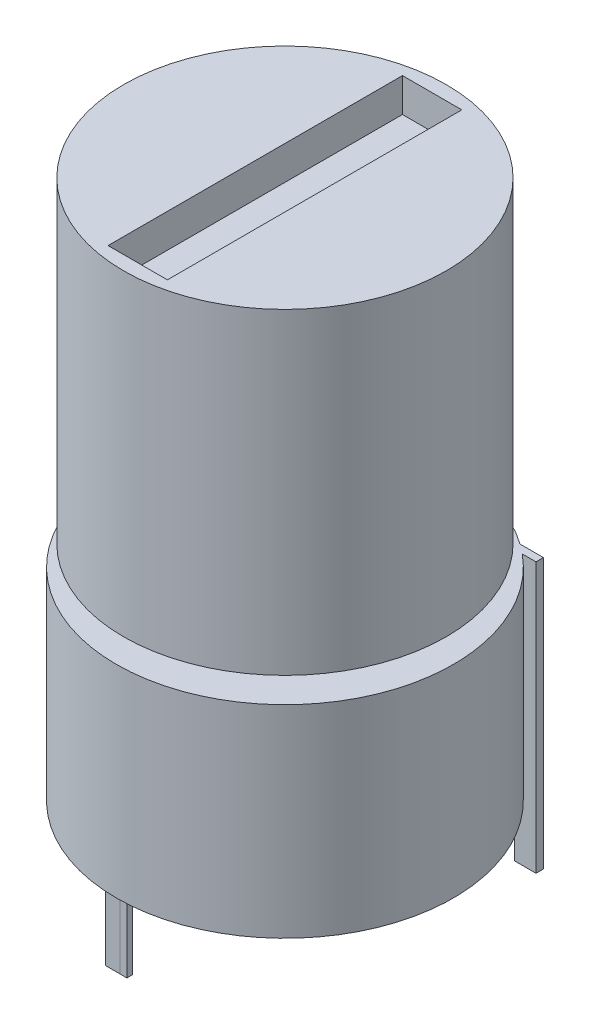
ISO-10303-21;
HEADER;
FILE_DESCRIPTION(('STEP AP214'),'2;1');
FILE_NAME('part.step','',(''),(''),'','','');
FILE_SCHEMA(('AUTOMOTIVE_DESIGN { 1 0 10303 214 1 1 1 1 }'));
ENDSEC;
DATA;
#1=APPLICATION_CONTEXT('core data for automotive mechanical design processes');
#2=APPLICATION_PROTOCOL_DEFINITION('international standard','automotive_design',2000,#1);
#3=PRODUCT_CONTEXT('',#1,'mechanical');
#4=PRODUCT('Part','Part','',(#3));
#5=PRODUCT_RELATED_PRODUCT_CATEGORY('part','',(#4));
#6=PRODUCT_DEFINITION_FORMATION('','',#4);
#7=PRODUCT_DEFINITION_CONTEXT('part definition',#1,'design');
#8=PRODUCT_DEFINITION('design','',#6,#7);
#9=PRODUCT_DEFINITION_SHAPE('','',#8);
#10=(LENGTH_UNIT() NAMED_UNIT(*) SI_UNIT(.MILLI.,.METRE.));
#11=(NAMED_UNIT(*) PLANE_ANGLE_UNIT() SI_UNIT($,.RADIAN.));
#12=(NAMED_UNIT(*) SI_UNIT($,.STERADIAN.) SOLID_ANGLE_UNIT());
#13=UNCERTAINTY_MEASURE_WITH_UNIT(LENGTH_MEASURE(1.E-05),#10,'distance_accuracy_value','');
#14=(GEOMETRIC_REPRESENTATION_CONTEXT(3) GLOBAL_UNCERTAINTY_ASSIGNED_CONTEXT((#13)) GLOBAL_UNIT_ASSIGNED_CONTEXT((#10,
#11,#12)) REPRESENTATION_CONTEXT('',''));
#15=CARTESIAN_POINT('',(0.,0.,0.));
#16=DIRECTION('',(0.,0.,1.));
#17=DIRECTION('',(1.,0.,0.));
#18=AXIS2_PLACEMENT_3D('',#15,#16,#17);
#19=CARTESIAN_POINT('',(0.,3.,0.));
#20=DIRECTION('',(0.,-1.,0.));
#21=DIRECTION('',(0.,0.,-1.));
#22=AXIS2_PLACEMENT_3D('',#19,#20,#21);
#23=CYLINDRICAL_SURFACE('',#22,2.5);
#24=CARTESIAN_POINT('',(0.,0.,0.));
#25=DIRECTION('',(0.,1.,0.));
#26=DIRECTION('',(0.,0.,1.));
#27=AXIS2_PLACEMENT_3D('',#24,#25,#26);
#28=CIRCLE('',#27,2.5);
#29=CARTESIAN_POINT('',(-1.59070932317395,0.,-1.92863782218629));
#30=VERTEX_POINT('',#29);
#31=CARTESIAN_POINT('',(1.59070932317395,0.,-1.92863782218629));
#32=VERTEX_POINT('',#31);
#33=EDGE_CURVE('E279',#30,#32,#28,.T.);
#34=ORIENTED_EDGE('',*,*,#33,.T.);
#35=DIRECTION('',(0.,-1.,0.));
#36=VECTOR('',#35,1.);
#37=CARTESIAN_POINT('',(1.59070932317395,3.,-1.92863782218629));
#38=LINE('',#37,#36);
#39=CARTESIAN_POINT('',(1.59070932317395,3.,-1.92863782218629));
#40=VERTEX_POINT('',#39);
#41=EDGE_CURVE('E401',#32,#40,#38,.F.);
#42=ORIENTED_EDGE('',*,*,#41,.T.);
#43=CARTESIAN_POINT('',(0.,3.,0.));
#44=DIRECTION('',(0.,1.,0.));
#45=DIRECTION('',(0.,0.,1.));
#46=AXIS2_PLACEMENT_3D('',#43,#44,#45);
#47=CIRCLE('',#46,2.5);
#48=CARTESIAN_POINT('',(-1.59070932317395,3.,-1.92863782218629));
#49=VERTEX_POINT('',#48);
#50=EDGE_CURVE('E50',#49,#40,#47,.T.);
#51=ORIENTED_EDGE('',*,*,#50,.F.);
#52=DIRECTION('',(0.,-1.,0.));
#53=VECTOR('',#52,1.);
#54=CARTESIAN_POINT('',(-1.59070932317395,3.,-1.92863782218629));
#55=LINE('',#54,#53);
#56=EDGE_CURVE('E325',#49,#30,#55,.T.);
#57=ORIENTED_EDGE('',*,*,#56,.T.);
#58=EDGE_LOOP('',(#34,#42,#51,#57));
#59=FACE_BOUND('',#58,.T.);
#60=ADVANCED_FACE('F41',(#59),#23,.T.);
#61=CARTESIAN_POINT('',(0.,0.,0.));
#62=DIRECTION('',(0.,1.,0.));
#63=DIRECTION('',(0.,0.,1.));
#64=AXIS2_PLACEMENT_3D('',#61,#62,#63);
#65=PLANE('',#64);
#66=ORIENTED_EDGE('',*,*,#33,.F.);
#67=DIRECTION('',(1.,0.,0.));
#68=VECTOR('',#67,1.);
#69=CARTESIAN_POINT('',(0.,0.,-1.92863782218629));
#70=LINE('',#69,#68);
#71=CARTESIAN_POINT('',(-1.4576514021515,0.,-1.92863782218629));
#72=VERTEX_POINT('',#71);
#73=EDGE_CURVE('E321',#30,#72,#70,.T.);
#74=ORIENTED_EDGE('',*,*,#73,.T.);
#75=DIRECTION('',(0.0960597372214122,0.,-0.995375570769623));
#76=VECTOR('',#75,1.);
#77=CARTESIAN_POINT('',(-1.62860866311877,0.,-0.157170544274803));
#78=LINE('',#77,#76);
#79=CARTESIAN_POINT('',(-1.44703463694375,0.,-2.03864924876376));
#80=VERTEX_POINT('',#79);
#81=EDGE_CURVE('E210',#72,#80,#78,.T.);
#82=ORIENTED_EDGE('',*,*,#81,.T.);
#83=CARTESIAN_POINT('',(1.44703463694375,0.,-2.03864924876376));
#84=VERTEX_POINT('',#83);
#85=EDGE_CURVE('E275',#84,#80,#28,.T.);
#86=ORIENTED_EDGE('',*,*,#85,.F.);
#87=DIRECTION('',(0.273201530301705,0.,0.961956820154006));
#88=VECTOR('',#87,1.);
#89=CARTESIAN_POINT('',(1.87480279385373,0.,-0.532455284440677));
#90=LINE('',#89,#88);
#91=CARTESIAN_POINT('',(1.47827854463477,0.,-1.92863782218629));
#92=VERTEX_POINT('',#91);
#93=EDGE_CURVE('E388',#84,#92,#90,.T.);
#94=ORIENTED_EDGE('',*,*,#93,.T.);
#95=DIRECTION('',(1.,0.,0.));
#96=VECTOR('',#95,1.);
#97=CARTESIAN_POINT('',(0.,0.,-1.92863782218629));
#98=LINE('',#97,#96);
#99=EDGE_CURVE('E404',#92,#32,#98,.T.);
#100=ORIENTED_EDGE('',*,*,#99,.T.);
#101=EDGE_LOOP('',(#66,#74,#82,#86,#94,#100));
#102=FACE_BOUND('',#101,.T.);
#103=DIRECTION('',(0.,0.,1.));
#104=VECTOR('',#103,1.);
#105=CARTESIAN_POINT('',(-0.215905033171868,0.,2.44807685298548));
#106=LINE('',#105,#104);
#107=CARTESIAN_POINT('',(-0.215905033171868,0.,2.3625477556104));
#108=VERTEX_POINT('',#107);
#109=CARTESIAN_POINT('',(-0.215905033171868,0.,2.44807685298548));
#110=VERTEX_POINT('',#109);
#111=EDGE_CURVE('E177',#108,#110,#106,.T.);
#112=ORIENTED_EDGE('',*,*,#111,.T.);
#113=DIRECTION('',(-1.,0.,0.));
#114=VECTOR('',#113,1.);
#115=CARTESIAN_POINT('',(0.,0.,2.44807685298548));
#116=LINE('',#115,#114);
#117=CARTESIAN_POINT('',(0.,0.,2.44807685298548));
#118=VERTEX_POINT('',#117);
#119=EDGE_CURVE('E204',#118,#110,#116,.T.);
#120=ORIENTED_EDGE('',*,*,#119,.F.);
#121=DIRECTION('',(-0.999900782422396,0.,-0.0140863519436609));
#122=VECTOR('',#121,1.);
#123=CARTESIAN_POINT('',(0.,0.,2.44807685298548));
#124=LINE('',#123,#122);
#125=CARTESIAN_POINT('',(0.105106814470731,0.,2.4495575714791));
#126=VERTEX_POINT('',#125);
#127=EDGE_CURVE('E203',#126,#118,#124,.T.);
#128=ORIENTED_EDGE('',*,*,#127,.F.);
#129=DIRECTION('',(0.,0.,-1.));
#130=VECTOR('',#129,1.);
#131=CARTESIAN_POINT('',(0.105106814470731,0.,2.4495575714791));
#132=LINE('',#131,#130);
#133=CARTESIAN_POINT('',(0.105106814470731,0.,2.3625477556104));
#134=VERTEX_POINT('',#133);
#135=EDGE_CURVE('E201',#126,#134,#132,.T.);
#136=ORIENTED_EDGE('',*,*,#135,.T.);
#137=DIRECTION('',(1.,0.,0.));
#138=VECTOR('',#137,1.);
#139=CARTESIAN_POINT('',(0.473512734090996,0.,2.3625477556104));
#140=LINE('',#139,#138);
#141=EDGE_CURVE('E193',#108,#134,#140,.T.);
#142=ORIENTED_EDGE('',*,*,#141,.F.);
#143=EDGE_LOOP('',(#112,#120,#128,#136,#142));
#144=FACE_BOUND('',#143,.T.);
#145=ADVANCED_FACE('F199',(#102,#144),#65,.F.);
#146=CARTESIAN_POINT('',(0.,10.3,0.));
#147=DIRECTION('',(0.,-1.,0.));
#148=DIRECTION('',(0.,0.,-1.));
#149=AXIS2_PLACEMENT_3D('',#146,#147,#148);
#150=CYLINDRICAL_SURFACE('',#149,0.18795365504404);
#151=CARTESIAN_POINT('',(0.,3.,0.));
#152=DIRECTION('',(0.,1.,0.));
#153=DIRECTION('',(0.,0.,1.));
#154=AXIS2_PLACEMENT_3D('',#151,#152,#153);
#155=CIRCLE('',#154,0.18795365504404);
#156=CARTESIAN_POINT('',(0.,3.,0.18795365504404));
#157=VERTEX_POINT('',#156);
#158=EDGE_CURVE('E268',#157,#157,#155,.T.);
#159=ORIENTED_EDGE('',*,*,#158,.T.);
#160=EDGE_LOOP('',(#159));
#161=FACE_BOUND('',#160,.T.);
#162=CARTESIAN_POINT('',(0.,3.3,0.));
#163=DIRECTION('',(0.,1.,0.));
#164=DIRECTION('',(0.,0.,1.));
#165=AXIS2_PLACEMENT_3D('',#162,#163,#164);
#166=CIRCLE('',#165,0.18795365504404);
#167=CARTESIAN_POINT('',(0.,3.3,0.18795365504404));
#168=VERTEX_POINT('',#167);
#169=EDGE_CURVE('E11',#168,#168,#166,.T.);
#170=ORIENTED_EDGE('',*,*,#169,.F.);
#171=EDGE_LOOP('',(#170));
#172=FACE_BOUND('',#171,.T.);
#173=ADVANCED_FACE('F483',(#161,#172),#150,.T.);
#174=CARTESIAN_POINT('',(1.44703463694375,3.,-2.03864924876376));
#175=VERTEX_POINT('',#174);
#176=CARTESIAN_POINT('',(-1.44703463694375,3.,-2.03864924876376));
#177=VERTEX_POINT('',#176);
#178=EDGE_CURVE('E278',#175,#177,#47,.T.);
#179=ORIENTED_EDGE('',*,*,#178,.F.);
#180=DIRECTION('',(0.,1.,0.));
#181=VECTOR('',#180,1.);
#182=CARTESIAN_POINT('',(1.44703463694375,-1.,-2.03864924876376));
#183=LINE('',#182,#181);
#184=EDGE_CURVE('E295',#84,#175,#183,.T.);
#185=ORIENTED_EDGE('',*,*,#184,.F.);
#186=ORIENTED_EDGE('',*,*,#85,.T.);
#187=DIRECTION('',(0.,1.,0.));
#188=VECTOR('',#187,1.);
#189=CARTESIAN_POINT('',(-1.44703463694375,-1.,-2.03864924876376));
#190=LINE('',#189,#188);
#191=EDGE_CURVE('E293',#80,#177,#190,.T.);
#192=ORIENTED_EDGE('',*,*,#191,.T.);
#193=EDGE_LOOP('',(#179,#185,#186,#192));
#194=FACE_BOUND('',#193,.T.);
#195=ADVANCED_FACE('F43',(#194),#23,.T.);
#196=CARTESIAN_POINT('',(0.,3.,0.));
#197=DIRECTION('',(0.,1.,0.));
#198=DIRECTION('',(0.,0.,1.));
#199=AXIS2_PLACEMENT_3D('',#196,#197,#198);
#200=PLANE('',#199);
#201=ORIENTED_EDGE('',*,*,#50,.T.);
#202=DIRECTION('',(1.,0.,0.));
#203=VECTOR('',#202,1.);
#204=CARTESIAN_POINT('',(1.794561396045,3.,-1.92863782218629));
#205=LINE('',#204,#203);
#206=CARTESIAN_POINT('',(1.794561396045,3.,-1.92863782218629));
#207=VERTEX_POINT('',#206);
#208=EDGE_CURVE('E345',#40,#207,#205,.T.);
#209=ORIENTED_EDGE('',*,*,#208,.T.);
#210=DIRECTION('',(0.,0.,-1.));
#211=VECTOR('',#210,1.);
#212=CARTESIAN_POINT('',(1.794561396045,3.,-2.03864924876376));
#213=LINE('',#212,#211);
#214=CARTESIAN_POINT('',(1.794561396045,3.,-2.03864924876376));
#215=VERTEX_POINT('',#214);
#216=EDGE_CURVE('E348',#207,#215,#213,.T.);
#217=ORIENTED_EDGE('',*,*,#216,.T.);
#218=DIRECTION('',(-1.,0.,0.));
#219=VECTOR('',#218,1.);
#220=CARTESIAN_POINT('',(1.44703463694375,3.,-2.03864924876376));
#221=LINE('',#220,#219);
#222=EDGE_CURVE('E366',#215,#175,#221,.T.);
#223=ORIENTED_EDGE('',*,*,#222,.T.);
#224=ORIENTED_EDGE('',*,*,#178,.T.);
#225=DIRECTION('',(-1.,0.,0.));
#226=VECTOR('',#225,1.);
#227=CARTESIAN_POINT('',(-1.76705853940064,3.,-2.03864924876376));
#228=LINE('',#227,#226);
#229=CARTESIAN_POINT('',(-1.76705853940064,3.,-2.03864924876376));
#230=VERTEX_POINT('',#229);
#231=EDGE_CURVE('E307',#177,#230,#228,.T.);
#232=ORIENTED_EDGE('',*,*,#231,.T.);
#233=DIRECTION('',(0.,0.,1.));
#234=VECTOR('',#233,1.);
#235=CARTESIAN_POINT('',(-1.76705853940064,3.,-1.92863782218629));
#236=LINE('',#235,#234);
#237=CARTESIAN_POINT('',(-1.76705853940064,3.,-1.92863782218629));
#238=VERTEX_POINT('',#237);
#239=EDGE_CURVE('E423',#230,#238,#236,.T.);
#240=ORIENTED_EDGE('',*,*,#239,.T.);
#241=DIRECTION('',(1.,0.,0.));
#242=VECTOR('',#241,1.);
#243=CARTESIAN_POINT('',(-1.4576514021515,3.,-1.92863782218629));
#244=LINE('',#243,#242);
#245=EDGE_CURVE('E411',#238,#49,#244,.T.);
#246=ORIENTED_EDGE('',*,*,#245,.T.);
#247=EDGE_LOOP('',(#201,#209,#217,#223,#224,#232,#240,#246));
#248=FACE_BOUND('',#247,.T.);
#249=ORIENTED_EDGE('',*,*,#158,.F.);
#250=EDGE_LOOP('',(#249));
#251=FACE_BOUND('',#250,.T.);
#252=ADVANCED_FACE('F450',(#248,#251),#200,.T.);
#253=CARTESIAN_POINT('',(0.,3.3,0.));
#254=DIRECTION('',(0.,1.,0.));
#255=DIRECTION('',(0.,0.,1.));
#256=AXIS2_PLACEMENT_3D('',#253,#254,#255);
#257=CYLINDRICAL_SURFACE('',#256,2.392138428225);
#258=CARTESIAN_POINT('',(0.,3.3,0.));
#259=DIRECTION('',(0.,1.,0.));
#260=DIRECTION('',(0.,0.,1.));
#261=AXIS2_PLACEMENT_3D('',#258,#259,#260);
#262=CIRCLE('',#261,2.392138428225);
#263=CARTESIAN_POINT('',(0.,3.3,2.392138428225));
#264=VERTEX_POINT('',#263);
#265=EDGE_CURVE('E264',#264,#264,#262,.T.);
#266=ORIENTED_EDGE('',*,*,#265,.T.);
#267=EDGE_LOOP('',(#266));
#268=FACE_BOUND('',#267,.T.);
#269=CARTESIAN_POINT('',(0.,8.,0.));
#270=DIRECTION('',(0.,1.,0.));
#271=DIRECTION('',(0.,0.,1.));
#272=AXIS2_PLACEMENT_3D('',#269,#270,#271);
#273=CIRCLE('',#272,2.392138428225);
#274=CARTESIAN_POINT('',(0.,8.,2.392138428225));
#275=VERTEX_POINT('',#274);
#276=EDGE_CURVE('E254',#275,#275,#273,.T.);
#277=ORIENTED_EDGE('',*,*,#276,.F.);
#278=EDGE_LOOP('',(#277));
#279=FACE_BOUND('',#278,.T.);
#280=ADVANCED_FACE('F489',(#268,#279),#257,.T.);
#281=CARTESIAN_POINT('',(0.,3.3,0.));
#282=DIRECTION('',(0.,1.,0.));
#283=DIRECTION('',(0.,0.,1.));
#284=AXIS2_PLACEMENT_3D('',#281,#282,#283);
#285=PLANE('',#284);
#286=ORIENTED_EDGE('',*,*,#169,.T.);
#287=EDGE_LOOP('',(#286));
#288=FACE_BOUND('',#287,.T.);
#289=ORIENTED_EDGE('',*,*,#265,.F.);
#290=EDGE_LOOP('',(#289));
#291=FACE_BOUND('',#290,.T.);
#292=ADVANCED_FACE('F501',(#288,#291),#285,.F.);
#293=CARTESIAN_POINT('',(0.,8.,0.));
#294=DIRECTION('',(0.,1.,0.));
#295=DIRECTION('',(0.,0.,1.));
#296=AXIS2_PLACEMENT_3D('',#293,#294,#295);
#297=PLANE('',#296);
#298=DIRECTION('',(0.,0.,-1.));
#299=VECTOR('',#298,1.);
#300=CARTESIAN_POINT('',(0.440045706309886,8.,2.18303924614673));
#301=LINE('',#300,#299);
#302=CARTESIAN_POINT('',(0.440045706309886,8.,2.18303924614673));
#303=VERTEX_POINT('',#302);
#304=CARTESIAN_POINT('',(0.440045706309886,8.,-2.18303924614673));
#305=VERTEX_POINT('',#304);
#306=EDGE_CURVE('E218',#303,#305,#301,.T.);
#307=ORIENTED_EDGE('',*,*,#306,.F.);
#308=DIRECTION('',(1.,0.,0.));
#309=VECTOR('',#308,1.);
#310=CARTESIAN_POINT('',(-0.440045706309886,8.,2.18303924614673));
#311=LINE('',#310,#309);
#312=CARTESIAN_POINT('',(-0.440045706309886,8.,2.18303924614673));
#313=VERTEX_POINT('',#312);
#314=EDGE_CURVE('E225',#313,#303,#311,.T.);
#315=ORIENTED_EDGE('',*,*,#314,.F.);
#316=DIRECTION('',(0.,0.,1.));
#317=VECTOR('',#316,1.);
#318=CARTESIAN_POINT('',(-0.440045706309886,8.,2.18303924614673));
#319=LINE('',#318,#317);
#320=CARTESIAN_POINT('',(-0.440045706309886,8.,-2.18303924614673));
#321=VERTEX_POINT('',#320);
#322=EDGE_CURVE('E244',#321,#313,#319,.T.);
#323=ORIENTED_EDGE('',*,*,#322,.F.);
#324=DIRECTION('',(-1.,0.,0.));
#325=VECTOR('',#324,1.);
#326=CARTESIAN_POINT('',(-0.440045706309886,8.,-2.18303924614673));
#327=LINE('',#326,#325);
#328=EDGE_CURVE('E240',#305,#321,#327,.T.);
#329=ORIENTED_EDGE('',*,*,#328,.F.);
#330=EDGE_LOOP('',(#307,#315,#323,#329));
#331=FACE_BOUND('',#330,.T.);
#332=ORIENTED_EDGE('',*,*,#276,.T.);
#333=EDGE_LOOP('',(#332));
#334=FACE_BOUND('',#333,.T.);
#335=ADVANCED_FACE('F497',(#331,#334),#297,.T.);
#336=CARTESIAN_POINT('',(0.440045706309886,7.5,2.18303924614673));
#337=DIRECTION('',(1.,0.,0.));
#338=DIRECTION('',(0.,0.,-1.));
#339=AXIS2_PLACEMENT_3D('',#336,#337,#338);
#340=PLANE('',#339);
#341=ORIENTED_EDGE('',*,*,#306,.T.);
#342=DIRECTION('',(0.,1.,0.));
#343=VECTOR('',#342,1.);
#344=CARTESIAN_POINT('',(0.440045706309886,7.5,-2.18303924614673));
#345=LINE('',#344,#343);
#346=CARTESIAN_POINT('',(0.440045706309886,7.5,-2.18303924614673));
#347=VERTEX_POINT('',#346);
#348=EDGE_CURVE('E237',#347,#305,#345,.T.);
#349=ORIENTED_EDGE('',*,*,#348,.F.);
#350=DIRECTION('',(0.,0.,-1.));
#351=VECTOR('',#350,1.);
#352=CARTESIAN_POINT('',(0.440045706309886,7.5,2.18303924614673));
#353=LINE('',#352,#351);
#354=CARTESIAN_POINT('',(0.440045706309886,7.5,2.18303924614673));
#355=VERTEX_POINT('',#354);
#356=EDGE_CURVE('E220',#355,#347,#353,.T.);
#357=ORIENTED_EDGE('',*,*,#356,.F.);
#358=DIRECTION('',(0.,1.,0.));
#359=VECTOR('',#358,1.);
#360=CARTESIAN_POINT('',(0.440045706309886,7.5,2.18303924614673));
#361=LINE('',#360,#359);
#362=EDGE_CURVE('E251',#355,#303,#361,.T.);
#363=ORIENTED_EDGE('',*,*,#362,.T.);
#364=EDGE_LOOP('',(#341,#349,#357,#363));
#365=FACE_BOUND('',#364,.T.);
#366=ADVANCED_FACE('F500',(#365),#340,.F.);
#367=CARTESIAN_POINT('',(-0.440045706309886,7.5,2.18303924614673));
#368=DIRECTION('',(0.,0.,1.));
#369=DIRECTION('',(1.,0.,0.));
#370=AXIS2_PLACEMENT_3D('',#367,#368,#369);
#371=PLANE('',#370);
#372=ORIENTED_EDGE('',*,*,#314,.T.);
#373=ORIENTED_EDGE('',*,*,#362,.F.);
#374=DIRECTION('',(1.,0.,0.));
#375=VECTOR('',#374,1.);
#376=CARTESIAN_POINT('',(-0.440045706309886,7.5,2.18303924614673));
#377=LINE('',#376,#375);
#378=CARTESIAN_POINT('',(-0.440045706309886,7.5,2.18303924614673));
#379=VERTEX_POINT('',#378);
#380=EDGE_CURVE('E233',#379,#355,#377,.T.);
#381=ORIENTED_EDGE('',*,*,#380,.F.);
#382=DIRECTION('',(0.,1.,0.));
#383=VECTOR('',#382,1.);
#384=CARTESIAN_POINT('',(-0.440045706309886,7.5,2.18303924614673));
#385=LINE('',#384,#383);
#386=EDGE_CURVE('E255',#379,#313,#385,.T.);
#387=ORIENTED_EDGE('',*,*,#386,.T.);
#388=EDGE_LOOP('',(#372,#373,#381,#387));
#389=FACE_BOUND('',#388,.T.);
#390=ADVANCED_FACE('F511',(#389),#371,.F.);
#391=CARTESIAN_POINT('',(-0.440045706309886,7.5,2.18303924614673));
#392=DIRECTION('',(-1.,0.,0.));
#393=DIRECTION('',(0.,0.,1.));
#394=AXIS2_PLACEMENT_3D('',#391,#392,#393);
#395=PLANE('',#394);
#396=ORIENTED_EDGE('',*,*,#322,.T.);
#397=ORIENTED_EDGE('',*,*,#386,.F.);
#398=DIRECTION('',(0.,0.,1.));
#399=VECTOR('',#398,1.);
#400=CARTESIAN_POINT('',(-0.440045706309886,7.5,2.18303924614673));
#401=LINE('',#400,#399);
#402=CARTESIAN_POINT('',(-0.440045706309886,7.5,-2.18303924614673));
#403=VERTEX_POINT('',#402);
#404=EDGE_CURVE('E229',#403,#379,#401,.T.);
#405=ORIENTED_EDGE('',*,*,#404,.F.);
#406=DIRECTION('',(0.,1.,0.));
#407=VECTOR('',#406,1.);
#408=CARTESIAN_POINT('',(-0.440045706309886,7.5,-2.18303924614673));
#409=LINE('',#408,#407);
#410=EDGE_CURVE('E258',#403,#321,#409,.T.);
#411=ORIENTED_EDGE('',*,*,#410,.T.);
#412=EDGE_LOOP('',(#396,#397,#405,#411));
#413=FACE_BOUND('',#412,.T.);
#414=ADVANCED_FACE('F517',(#413),#395,.F.);
#415=CARTESIAN_POINT('',(-0.440045706309886,7.5,-2.18303924614673));
#416=DIRECTION('',(0.,0.,-1.));
#417=DIRECTION('',(-1.,0.,0.));
#418=AXIS2_PLACEMENT_3D('',#415,#416,#417);
#419=PLANE('',#418);
#420=ORIENTED_EDGE('',*,*,#328,.T.);
#421=ORIENTED_EDGE('',*,*,#410,.F.);
#422=DIRECTION('',(-1.,0.,0.));
#423=VECTOR('',#422,1.);
#424=CARTESIAN_POINT('',(-0.440045706309886,7.5,-2.18303924614673));
#425=LINE('',#424,#423);
#426=EDGE_CURVE('E224',#347,#403,#425,.T.);
#427=ORIENTED_EDGE('',*,*,#426,.F.);
#428=ORIENTED_EDGE('',*,*,#348,.T.);
#429=EDGE_LOOP('',(#420,#421,#427,#428));
#430=FACE_BOUND('',#429,.T.);
#431=ADVANCED_FACE('F513',(#430),#419,.F.);
#432=CARTESIAN_POINT('',(0.,7.5,0.));
#433=DIRECTION('',(0.,-1.,0.));
#434=DIRECTION('',(0.,0.,-1.));
#435=AXIS2_PLACEMENT_3D('',#432,#433,#434);
#436=PLANE('',#435);
#437=ORIENTED_EDGE('',*,*,#356,.T.);
#438=ORIENTED_EDGE('',*,*,#426,.T.);
#439=ORIENTED_EDGE('',*,*,#404,.T.);
#440=ORIENTED_EDGE('',*,*,#380,.T.);
#441=EDGE_LOOP('',(#437,#438,#439,#440));
#442=FACE_BOUND('',#441,.T.);
#443=ADVANCED_FACE('F516',(#442),#436,.F.);
#444=CARTESIAN_POINT('',(0.,-1.,2.44807685298548));
#445=DIRECTION('',(0.,0.,-1.));
#446=DIRECTION('',(-1.,0.,0.));
#447=AXIS2_PLACEMENT_3D('',#444,#445,#446);
#448=PLANE('',#447);
#449=ORIENTED_EDGE('',*,*,#119,.T.);
#450=DIRECTION('',(0.,-1.,0.));
#451=VECTOR('',#450,1.);
#452=CARTESIAN_POINT('',(-0.215905033171868,0.,2.44807685298548));
#453=LINE('',#452,#451);
#454=CARTESIAN_POINT('',(-0.215905033171868,-1.,2.44807685298548));
#455=VERTEX_POINT('',#454);
#456=EDGE_CURVE('E180',#110,#455,#453,.T.);
#457=ORIENTED_EDGE('',*,*,#456,.T.);
#458=DIRECTION('',(-1.,0.,0.));
#459=VECTOR('',#458,1.);
#460=CARTESIAN_POINT('',(0.,-1.,2.44807685298548));
#461=LINE('',#460,#459);
#462=CARTESIAN_POINT('',(0.,-1.,2.44807685298548));
#463=VERTEX_POINT('',#462);
#464=EDGE_CURVE('E208',#463,#455,#461,.T.);
#465=ORIENTED_EDGE('',*,*,#464,.F.);
#466=DIRECTION('',(0.,1.,0.));
#467=VECTOR('',#466,1.);
#468=CARTESIAN_POINT('',(0.,-1.,2.44807685298548));
#469=LINE('',#468,#467);
#470=EDGE_CURVE('E214',#463,#118,#469,.T.);
#471=ORIENTED_EDGE('',*,*,#470,.T.);
#472=EDGE_LOOP('',(#449,#457,#465,#471));
#473=FACE_BOUND('',#472,.T.);
#474=ADVANCED_FACE('F343',(#473),#448,.F.);
#475=CARTESIAN_POINT('',(0.473512734090996,-1.,2.3625477556104));
#476=DIRECTION('',(0.,0.,1.));
#477=DIRECTION('',(1.,0.,0.));
#478=AXIS2_PLACEMENT_3D('',#475,#476,#477);
#479=PLANE('',#478);
#480=DIRECTION('',(1.,0.,0.));
#481=VECTOR('',#480,1.);
#482=CARTESIAN_POINT('',(0.473512734090996,-1.,2.3625477556104));
#483=LINE('',#482,#481);
#484=CARTESIAN_POINT('',(-0.215905033171868,-1.,2.3625477556104));
#485=VERTEX_POINT('',#484);
#486=CARTESIAN_POINT('',(0.105106814470731,-1.,2.3625477556104));
#487=VERTEX_POINT('',#486);
#488=EDGE_CURVE('E195',#485,#487,#483,.T.);
#489=ORIENTED_EDGE('',*,*,#488,.F.);
#490=DIRECTION('',(0.,-1.,0.));
#491=VECTOR('',#490,1.);
#492=CARTESIAN_POINT('',(-0.215905033171868,0.,2.3625477556104));
#493=LINE('',#492,#491);
#494=EDGE_CURVE('E65',#108,#485,#493,.T.);
#495=ORIENTED_EDGE('',*,*,#494,.F.);
#496=ORIENTED_EDGE('',*,*,#141,.T.);
#497=DIRECTION('',(0.,-1.,0.));
#498=VECTOR('',#497,1.);
#499=CARTESIAN_POINT('',(0.105106814470731,0.,2.3625477556104));
#500=LINE('',#499,#498);
#501=EDGE_CURVE('E356',#134,#487,#500,.T.);
#502=ORIENTED_EDGE('',*,*,#501,.T.);
#503=EDGE_LOOP('',(#489,#495,#496,#502));
#504=FACE_BOUND('',#503,.T.);
#505=ADVANCED_FACE('F191',(#504),#479,.F.);
#506=CARTESIAN_POINT('',(0.,-1.,2.44807685298548));
#507=DIRECTION('',(0.0140863519436609,0.,-0.999900782422396));
#508=DIRECTION('',(-0.999900782422396,0.,-0.0140863519436609));
#509=AXIS2_PLACEMENT_3D('',#506,#507,#508);
#510=PLANE('',#509);
#511=DIRECTION('',(-0.999900782422396,0.,-0.0140863519436609));
#512=VECTOR('',#511,1.);
#513=CARTESIAN_POINT('',(0.,-1.,2.44807685298548));
#514=LINE('',#513,#512);
#515=CARTESIAN_POINT('',(0.105106814470731,-1.,2.4495575714791));
#516=VERTEX_POINT('',#515);
#517=EDGE_CURVE('E219',#516,#463,#514,.T.);
#518=ORIENTED_EDGE('',*,*,#517,.F.);
#519=DIRECTION('',(0.,-1.,0.));
#520=VECTOR('',#519,1.);
#521=CARTESIAN_POINT('',(0.105106814470731,0.,2.4495575714791));
#522=LINE('',#521,#520);
#523=EDGE_CURVE('E57',#126,#516,#522,.T.);
#524=ORIENTED_EDGE('',*,*,#523,.F.);
#525=ORIENTED_EDGE('',*,*,#127,.T.);
#526=ORIENTED_EDGE('',*,*,#470,.F.);
#527=EDGE_LOOP('',(#518,#524,#525,#526));
#528=FACE_BOUND('',#527,.T.);
#529=ADVANCED_FACE('F341',(#528),#510,.F.);
#530=CARTESIAN_POINT('',(0.,-1.,0.));
#531=DIRECTION('',(0.,-1.,0.));
#532=DIRECTION('',(0.,0.,-1.));
#533=AXIS2_PLACEMENT_3D('',#530,#531,#532);
#534=PLANE('',#533);
#535=DIRECTION('',(0.,0.,1.));
#536=VECTOR('',#535,1.);
#537=CARTESIAN_POINT('',(-0.215905033171868,-1.,2.44807685298548));
#538=LINE('',#537,#536);
#539=EDGE_CURVE('E186',#485,#455,#538,.T.);
#540=ORIENTED_EDGE('',*,*,#539,.F.);
#541=ORIENTED_EDGE('',*,*,#488,.T.);
#542=DIRECTION('',(0.,0.,-1.));
#543=VECTOR('',#542,1.);
#544=CARTESIAN_POINT('',(0.105106814470731,-1.,2.4495575714791));
#545=LINE('',#544,#543);
#546=EDGE_CURVE('E339',#516,#487,#545,.T.);
#547=ORIENTED_EDGE('',*,*,#546,.F.);
#548=ORIENTED_EDGE('',*,*,#517,.T.);
#549=ORIENTED_EDGE('',*,*,#464,.T.);
#550=EDGE_LOOP('',(#540,#541,#547,#548,#549));
#551=FACE_BOUND('',#550,.T.);
#552=ADVANCED_FACE('F337',(#551),#534,.T.);
#553=CARTESIAN_POINT('',(-1.44703463694375,-1.,-2.03864924876376));
#554=DIRECTION('',(0.995375570769623,0.,0.0960597372214121));
#555=DIRECTION('',(0.0960597372214122,0.,-0.995375570769623));
#556=AXIS2_PLACEMENT_3D('',#553,#554,#555);
#557=PLANE('',#556);
#558=ORIENTED_EDGE('',*,*,#81,.F.);
#559=DIRECTION('',(0.,1.,0.));
#560=VECTOR('',#559,1.);
#561=CARTESIAN_POINT('',(-1.4576514021515,-1.,-1.92863782218629));
#562=LINE('',#561,#560);
#563=CARTESIAN_POINT('',(-1.4576514021515,-1.,-1.92863782218629));
#564=VERTEX_POINT('',#563);
#565=EDGE_CURVE('E429',#564,#72,#562,.T.);
#566=ORIENTED_EDGE('',*,*,#565,.F.);
#567=DIRECTION('',(0.0960597372214122,0.,-0.995375570769623));
#568=VECTOR('',#567,1.);
#569=CARTESIAN_POINT('',(-1.44703463694375,-1.,-2.03864924876376));
#570=LINE('',#569,#568);
#571=CARTESIAN_POINT('',(-1.44703463694375,-1.,-2.03864924876376));
#572=VERTEX_POINT('',#571);
#573=EDGE_CURVE('E316',#564,#572,#570,.T.);
#574=ORIENTED_EDGE('',*,*,#573,.T.);
#575=EDGE_CURVE('E304',#572,#80,#190,.T.);
#576=ORIENTED_EDGE('',*,*,#575,.T.);
#577=EDGE_LOOP('',(#558,#566,#574,#576));
#578=FACE_BOUND('',#577,.T.);
#579=ADVANCED_FACE('F313',(#578),#557,.T.);
#580=CARTESIAN_POINT('',(-1.4576514021515,-1.,-1.92863782218629));
#581=DIRECTION('',(0.,0.,1.));
#582=DIRECTION('',(1.,0.,0.));
#583=AXIS2_PLACEMENT_3D('',#580,#581,#582);
#584=PLANE('',#583);
#585=ORIENTED_EDGE('',*,*,#73,.F.);
#586=ORIENTED_EDGE('',*,*,#56,.F.);
#587=ORIENTED_EDGE('',*,*,#245,.F.);
#588=DIRECTION('',(0.,1.,0.));
#589=VECTOR('',#588,1.);
#590=CARTESIAN_POINT('',(-1.76705853940064,-1.,-1.92863782218629));
#591=LINE('',#590,#589);
#592=CARTESIAN_POINT('',(-1.76705853940064,-1.,-1.92863782218629));
#593=VERTEX_POINT('',#592);
#594=EDGE_CURVE('E432',#593,#238,#591,.T.);
#595=ORIENTED_EDGE('',*,*,#594,.F.);
#596=DIRECTION('',(1.,0.,0.));
#597=VECTOR('',#596,1.);
#598=CARTESIAN_POINT('',(-1.4576514021515,-1.,-1.92863782218629));
#599=LINE('',#598,#597);
#600=EDGE_CURVE('E309',#593,#564,#599,.T.);
#601=ORIENTED_EDGE('',*,*,#600,.T.);
#602=ORIENTED_EDGE('',*,*,#565,.T.);
#603=EDGE_LOOP('',(#585,#586,#587,#595,#601,#602));
#604=FACE_BOUND('',#603,.T.);
#605=ADVANCED_FACE('F441',(#604),#584,.T.);
#606=CARTESIAN_POINT('',(-1.76705853940064,-1.,-1.92863782218629));
#607=DIRECTION('',(-1.,0.,0.));
#608=DIRECTION('',(0.,0.,1.));
#609=AXIS2_PLACEMENT_3D('',#606,#607,#608);
#610=PLANE('',#609);
#611=ORIENTED_EDGE('',*,*,#239,.F.);
#612=DIRECTION('',(0.,1.,0.));
#613=VECTOR('',#612,1.);
#614=CARTESIAN_POINT('',(-1.76705853940064,-1.,-2.03864924876376));
#615=LINE('',#614,#613);
#616=CARTESIAN_POINT('',(-1.76705853940064,-1.,-2.03864924876376));
#617=VERTEX_POINT('',#616);
#618=EDGE_CURVE('E318',#617,#230,#615,.T.);
#619=ORIENTED_EDGE('',*,*,#618,.F.);
#620=DIRECTION('',(0.,0.,1.));
#621=VECTOR('',#620,1.);
#622=CARTESIAN_POINT('',(-1.76705853940064,-1.,-1.92863782218629));
#623=LINE('',#622,#621);
#624=EDGE_CURVE('E414',#617,#593,#623,.T.);
#625=ORIENTED_EDGE('',*,*,#624,.T.);
#626=ORIENTED_EDGE('',*,*,#594,.T.);
#627=EDGE_LOOP('',(#611,#619,#625,#626));
#628=FACE_BOUND('',#627,.T.);
#629=ADVANCED_FACE('F448',(#628),#610,.T.);
#630=CARTESIAN_POINT('',(-1.76705853940064,-1.,-2.03864924876376));
#631=DIRECTION('',(0.,0.,-1.));
#632=DIRECTION('',(-1.,0.,0.));
#633=AXIS2_PLACEMENT_3D('',#630,#631,#632);
#634=PLANE('',#633);
#635=ORIENTED_EDGE('',*,*,#231,.F.);
#636=ORIENTED_EDGE('',*,*,#191,.F.);
#637=ORIENTED_EDGE('',*,*,#575,.F.);
#638=DIRECTION('',(-1.,0.,0.));
#639=VECTOR('',#638,1.);
#640=CARTESIAN_POINT('',(-1.76705853940064,-1.,-2.03864924876376));
#641=LINE('',#640,#639);
#642=EDGE_CURVE('E410',#572,#617,#641,.T.);
#643=ORIENTED_EDGE('',*,*,#642,.T.);
#644=ORIENTED_EDGE('',*,*,#618,.T.);
#645=EDGE_LOOP('',(#635,#636,#637,#643,#644));
#646=FACE_BOUND('',#645,.T.);
#647=ADVANCED_FACE('F302',(#646),#634,.T.);
#648=CARTESIAN_POINT('',(0.,-1.,0.));
#649=DIRECTION('',(0.,-1.,0.));
#650=DIRECTION('',(0.,0.,-1.));
#651=AXIS2_PLACEMENT_3D('',#648,#649,#650);
#652=PLANE('',#651);
#653=ORIENTED_EDGE('',*,*,#573,.F.);
#654=ORIENTED_EDGE('',*,*,#600,.F.);
#655=ORIENTED_EDGE('',*,*,#624,.F.);
#656=ORIENTED_EDGE('',*,*,#642,.F.);
#657=EDGE_LOOP('',(#653,#654,#655,#656));
#658=FACE_BOUND('',#657,.T.);
#659=ADVANCED_FACE('F444',(#658),#652,.T.);
#660=CARTESIAN_POINT('',(1.794561396045,-1.,-1.92863782218629));
#661=DIRECTION('',(0.,0.,1.));
#662=DIRECTION('',(1.,0.,0.));
#663=AXIS2_PLACEMENT_3D('',#660,#661,#662);
#664=PLANE('',#663);
#665=ORIENTED_EDGE('',*,*,#99,.F.);
#666=DIRECTION('',(0.,1.,0.));
#667=VECTOR('',#666,1.);
#668=CARTESIAN_POINT('',(1.47827854463477,-1.,-1.92863782218629));
#669=LINE('',#668,#667);
#670=CARTESIAN_POINT('',(1.47827854463477,-1.,-1.92863782218629));
#671=VERTEX_POINT('',#670);
#672=EDGE_CURVE('E384',#671,#92,#669,.T.);
#673=ORIENTED_EDGE('',*,*,#672,.F.);
#674=DIRECTION('',(1.,0.,0.));
#675=VECTOR('',#674,1.);
#676=CARTESIAN_POINT('',(1.794561396045,-1.,-1.92863782218629));
#677=LINE('',#676,#675);
#678=CARTESIAN_POINT('',(1.794561396045,-1.,-1.92863782218629));
#679=VERTEX_POINT('',#678);
#680=EDGE_CURVE('E361',#671,#679,#677,.T.);
#681=ORIENTED_EDGE('',*,*,#680,.T.);
#682=DIRECTION('',(0.,1.,0.));
#683=VECTOR('',#682,1.);
#684=CARTESIAN_POINT('',(1.794561396045,-1.,-1.92863782218629));
#685=LINE('',#684,#683);
#686=EDGE_CURVE('E377',#679,#207,#685,.T.);
#687=ORIENTED_EDGE('',*,*,#686,.T.);
#688=ORIENTED_EDGE('',*,*,#208,.F.);
#689=ORIENTED_EDGE('',*,*,#41,.F.);
#690=EDGE_LOOP('',(#665,#673,#681,#687,#688,#689));
#691=FACE_BOUND('',#690,.T.);
#692=ADVANCED_FACE('F462',(#691),#664,.T.);
#693=CARTESIAN_POINT('',(1.47827854463477,-1.,-1.92863782218629));
#694=DIRECTION('',(-0.961956820154006,0.,0.273201530301705));
#695=DIRECTION('',(0.273201530301705,0.,0.961956820154006));
#696=AXIS2_PLACEMENT_3D('',#693,#694,#695);
#697=PLANE('',#696);
#698=ORIENTED_EDGE('',*,*,#93,.F.);
#699=CARTESIAN_POINT('',(1.44703463694375,-1.,-2.03864924876376));
#700=VERTEX_POINT('',#699);
#701=EDGE_CURVE('E389',#700,#84,#183,.T.);
#702=ORIENTED_EDGE('',*,*,#701,.F.);
#703=DIRECTION('',(0.273201530301705,0.,0.961956820154006));
#704=VECTOR('',#703,1.);
#705=CARTESIAN_POINT('',(1.47827854463477,-1.,-1.92863782218629));
#706=LINE('',#705,#704);
#707=EDGE_CURVE('E374',#700,#671,#706,.T.);
#708=ORIENTED_EDGE('',*,*,#707,.T.);
#709=ORIENTED_EDGE('',*,*,#672,.T.);
#710=EDGE_LOOP('',(#698,#702,#708,#709));
#711=FACE_BOUND('',#710,.T.);
#712=ADVANCED_FACE('F460',(#711),#697,.T.);
#713=CARTESIAN_POINT('',(1.44703463694375,-1.,-2.03864924876376));
#714=DIRECTION('',(0.,0.,-1.));
#715=DIRECTION('',(-1.,0.,0.));
#716=AXIS2_PLACEMENT_3D('',#713,#714,#715);
#717=PLANE('',#716);
#718=ORIENTED_EDGE('',*,*,#222,.F.);
#719=DIRECTION('',(0.,1.,0.));
#720=VECTOR('',#719,1.);
#721=CARTESIAN_POINT('',(1.794561396045,-1.,-2.03864924876376));
#722=LINE('',#721,#720);
#723=CARTESIAN_POINT('',(1.794561396045,-1.,-2.03864924876376));
#724=VERTEX_POINT('',#723);
#725=EDGE_CURVE('E393',#724,#215,#722,.T.);
#726=ORIENTED_EDGE('',*,*,#725,.F.);
#727=DIRECTION('',(-1.,0.,0.));
#728=VECTOR('',#727,1.);
#729=CARTESIAN_POINT('',(1.44703463694375,-1.,-2.03864924876376));
#730=LINE('',#729,#728);
#731=EDGE_CURVE('E370',#724,#700,#730,.T.);
#732=ORIENTED_EDGE('',*,*,#731,.T.);
#733=ORIENTED_EDGE('',*,*,#701,.T.);
#734=ORIENTED_EDGE('',*,*,#184,.T.);
#735=EDGE_LOOP('',(#718,#726,#732,#733,#734));
#736=FACE_BOUND('',#735,.T.);
#737=ADVANCED_FACE('F455',(#736),#717,.T.);
#738=CARTESIAN_POINT('',(1.794561396045,-1.,-2.03864924876376));
#739=DIRECTION('',(1.,0.,0.));
#740=DIRECTION('',(0.,0.,-1.));
#741=AXIS2_PLACEMENT_3D('',#738,#739,#740);
#742=PLANE('',#741);
#743=ORIENTED_EDGE('',*,*,#216,.F.);
#744=ORIENTED_EDGE('',*,*,#686,.F.);
#745=DIRECTION('',(0.,0.,-1.));
#746=VECTOR('',#745,1.);
#747=CARTESIAN_POINT('',(1.794561396045,-1.,-2.03864924876376));
#748=LINE('',#747,#746);
#749=EDGE_CURVE('E365',#679,#724,#748,.T.);
#750=ORIENTED_EDGE('',*,*,#749,.T.);
#751=ORIENTED_EDGE('',*,*,#725,.T.);
#752=EDGE_LOOP('',(#743,#744,#750,#751));
#753=FACE_BOUND('',#752,.T.);
#754=ADVANCED_FACE('F466',(#753),#742,.T.);
#755=CARTESIAN_POINT('',(0.,-1.,0.));
#756=DIRECTION('',(0.,1.,0.));
#757=DIRECTION('',(0.,0.,1.));
#758=AXIS2_PLACEMENT_3D('',#755,#756,#757);
#759=PLANE('',#758);
#760=ORIENTED_EDGE('',*,*,#680,.F.);
#761=ORIENTED_EDGE('',*,*,#707,.F.);
#762=ORIENTED_EDGE('',*,*,#731,.F.);
#763=ORIENTED_EDGE('',*,*,#749,.F.);
#764=EDGE_LOOP('',(#760,#761,#762,#763));
#765=FACE_BOUND('',#764,.T.);
#766=ADVANCED_FACE('F468',(#765),#759,.F.);
#767=CARTESIAN_POINT('',(0.105106814470731,0.,2.4495575714791));
#768=DIRECTION('',(-1.,0.,0.));
#769=DIRECTION('',(0.,0.,1.));
#770=AXIS2_PLACEMENT_3D('',#767,#768,#769);
#771=PLANE('',#770);
#772=ORIENTED_EDGE('',*,*,#546,.T.);
#773=ORIENTED_EDGE('',*,*,#501,.F.);
#774=ORIENTED_EDGE('',*,*,#135,.F.);
#775=ORIENTED_EDGE('',*,*,#523,.T.);
#776=EDGE_LOOP('',(#772,#773,#774,#775));
#777=FACE_BOUND('',#776,.T.);
#778=ADVANCED_FACE('F470',(#777),#771,.F.);
#779=CARTESIAN_POINT('',(-0.215905033171868,0.,2.44807685298548));
#780=DIRECTION('',(1.,0.,0.));
#781=DIRECTION('',(0.,0.,-1.));
#782=AXIS2_PLACEMENT_3D('',#779,#780,#781);
#783=PLANE('',#782);
#784=ORIENTED_EDGE('',*,*,#539,.T.);
#785=ORIENTED_EDGE('',*,*,#456,.F.);
#786=ORIENTED_EDGE('',*,*,#111,.F.);
#787=ORIENTED_EDGE('',*,*,#494,.T.);
#788=EDGE_LOOP('',(#784,#785,#786,#787));
#789=FACE_BOUND('',#788,.T.);
#790=ADVANCED_FACE('F178',(#789),#783,.F.);
#791=CLOSED_SHELL('',(#60,#145,#173,#195,#252,#280,#292,#335,#366,#390,#414,#431,#443,#474,#505,
#529,#552,#579,#605,#629,#647,#659,#692,#712,#737,#754,#766,#778,#790));
#792=MANIFOLD_SOLID_BREP('B2',#791);
#793=ADVANCED_BREP_SHAPE_REPRESENTATION('',(#18,#792),#14);
#794=SHAPE_DEFINITION_REPRESENTATION(#9,#793);
ENDSEC;
END-ISO-10303-21;
